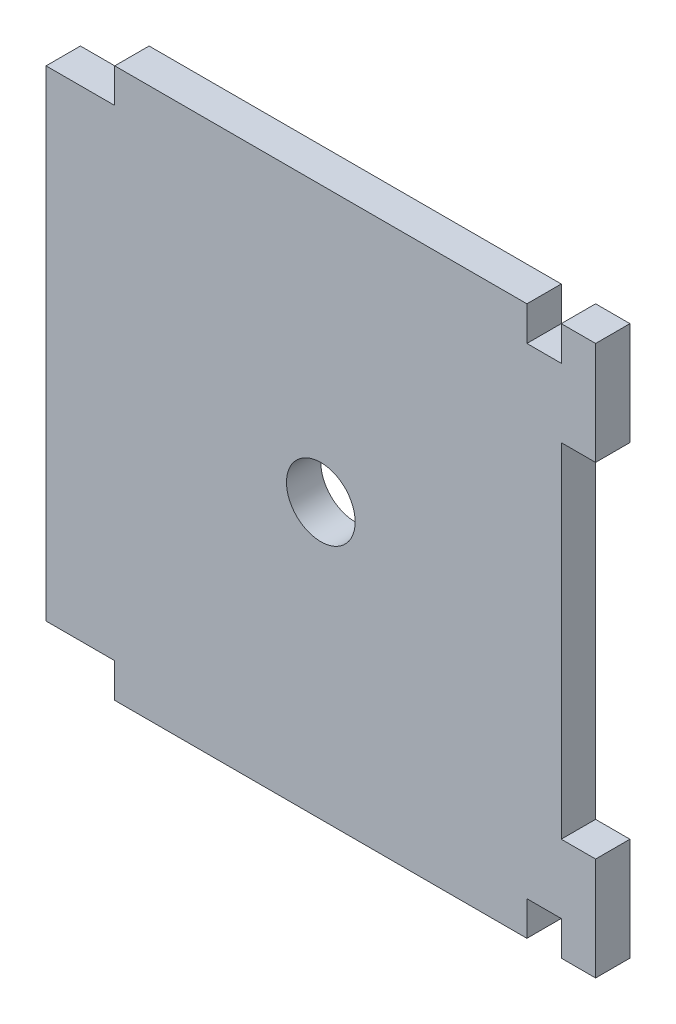
ISO-10303-21;
HEADER;
FILE_DESCRIPTION(('STEP AP214'),'2;1');
FILE_NAME('part.step','',(''),(''),'','','');
FILE_SCHEMA(('AUTOMOTIVE_DESIGN { 1 0 10303 214 1 1 1 1 }'));
ENDSEC;
DATA;
#1=APPLICATION_CONTEXT('core data for automotive mechanical design processes');
#2=APPLICATION_PROTOCOL_DEFINITION('international standard','automotive_design',2000,#1);
#3=PRODUCT_CONTEXT('',#1,'mechanical');
#4=PRODUCT('Part','Part','',(#3));
#5=PRODUCT_RELATED_PRODUCT_CATEGORY('part','',(#4));
#6=PRODUCT_DEFINITION_FORMATION('','',#4);
#7=PRODUCT_DEFINITION_CONTEXT('part definition',#1,'design');
#8=PRODUCT_DEFINITION('design','',#6,#7);
#9=PRODUCT_DEFINITION_SHAPE('','',#8);
#10=(LENGTH_UNIT() NAMED_UNIT(*) SI_UNIT(.MILLI.,.METRE.));
#11=(NAMED_UNIT(*) PLANE_ANGLE_UNIT() SI_UNIT($,.RADIAN.));
#12=(NAMED_UNIT(*) SI_UNIT($,.STERADIAN.) SOLID_ANGLE_UNIT());
#13=UNCERTAINTY_MEASURE_WITH_UNIT(LENGTH_MEASURE(1.E-05),#10,'distance_accuracy_value','');
#14=(GEOMETRIC_REPRESENTATION_CONTEXT(3) GLOBAL_UNCERTAINTY_ASSIGNED_CONTEXT((#13)) GLOBAL_UNIT_ASSIGNED_CONTEXT((#10,
#11,#12)) REPRESENTATION_CONTEXT('',''));
#15=CARTESIAN_POINT('',(0.,0.,0.));
#16=DIRECTION('',(0.,0.,1.));
#17=DIRECTION('',(1.,0.,0.));
#18=AXIS2_PLACEMENT_3D('',#15,#16,#17);
#19=CARTESIAN_POINT('',(80.,80.,5.));
#20=DIRECTION('',(0.,-1.,0.));
#21=DIRECTION('',(1.,0.,0.));
#22=AXIS2_PLACEMENT_3D('',#19,#20,#21);
#23=PLANE('',#22);
#24=DIRECTION('',(-1.,0.,0.));
#25=VECTOR('',#24,1.);
#26=CARTESIAN_POINT('',(80.,80.,0.));
#27=LINE('',#26,#25);
#28=CARTESIAN_POINT('',(80.,80.,0.));
#29=VERTEX_POINT('',#28);
#30=CARTESIAN_POINT('',(75.,80.,0.));
#31=VERTEX_POINT('',#30);
#32=EDGE_CURVE('E316',#29,#31,#27,.T.);
#33=ORIENTED_EDGE('',*,*,#32,.T.);
#34=DIRECTION('',(0.,0.,1.));
#35=VECTOR('',#34,1.);
#36=CARTESIAN_POINT('',(75.,80.,0.));
#37=LINE('',#36,#35);
#38=CARTESIAN_POINT('',(75.,80.,5.));
#39=VERTEX_POINT('',#38);
#40=EDGE_CURVE('E200',#31,#39,#37,.T.);
#41=ORIENTED_EDGE('',*,*,#40,.T.);
#42=DIRECTION('',(-1.,0.,0.));
#43=VECTOR('',#42,1.);
#44=CARTESIAN_POINT('',(80.,80.,5.));
#45=LINE('',#44,#43);
#46=CARTESIAN_POINT('',(80.,80.,5.));
#47=VERTEX_POINT('',#46);
#48=EDGE_CURVE('E304',#47,#39,#45,.T.);
#49=ORIENTED_EDGE('',*,*,#48,.F.);
#50=DIRECTION('',(0.,0.,-1.));
#51=VECTOR('',#50,1.);
#52=CARTESIAN_POINT('',(80.,80.,5.));
#53=LINE('',#52,#51);
#54=EDGE_CURVE('E11',#47,#29,#53,.T.);
#55=ORIENTED_EDGE('',*,*,#54,.T.);
#56=EDGE_LOOP('',(#33,#41,#49,#55));
#57=FACE_BOUND('',#56,.T.);
#58=ADVANCED_FACE('F33',(#57),#23,.F.);
#59=CARTESIAN_POINT('',(80.,0.,5.));
#60=DIRECTION('',(0.,1.,0.));
#61=DIRECTION('',(-1.,0.,0.));
#62=AXIS2_PLACEMENT_3D('',#59,#60,#61);
#63=PLANE('',#62);
#64=DIRECTION('',(1.,0.,0.));
#65=VECTOR('',#64,1.);
#66=CARTESIAN_POINT('',(80.,0.,5.));
#67=LINE('',#66,#65);
#68=CARTESIAN_POINT('',(75.,0.,5.));
#69=VERTEX_POINT('',#68);
#70=CARTESIAN_POINT('',(80.,0.,5.));
#71=VERTEX_POINT('',#70);
#72=EDGE_CURVE('E309',#69,#71,#67,.T.);
#73=ORIENTED_EDGE('',*,*,#72,.F.);
#74=DIRECTION('',(0.,0.,1.));
#75=VECTOR('',#74,1.);
#76=CARTESIAN_POINT('',(75.,0.,0.));
#77=LINE('',#76,#75);
#78=CARTESIAN_POINT('',(75.,0.,0.));
#79=VERTEX_POINT('',#78);
#80=EDGE_CURVE('E222',#79,#69,#77,.T.);
#81=ORIENTED_EDGE('',*,*,#80,.F.);
#82=DIRECTION('',(1.,0.,0.));
#83=VECTOR('',#82,1.);
#84=CARTESIAN_POINT('',(80.,0.,0.));
#85=LINE('',#84,#83);
#86=CARTESIAN_POINT('',(80.,0.,0.));
#87=VERTEX_POINT('',#86);
#88=EDGE_CURVE('E321',#79,#87,#85,.T.);
#89=ORIENTED_EDGE('',*,*,#88,.T.);
#90=DIRECTION('',(0.,0.,-1.));
#91=VECTOR('',#90,1.);
#92=CARTESIAN_POINT('',(80.,0.,5.));
#93=LINE('',#92,#91);
#94=EDGE_CURVE('E41',#71,#87,#93,.T.);
#95=ORIENTED_EDGE('',*,*,#94,.F.);
#96=EDGE_LOOP('',(#73,#81,#89,#95));
#97=FACE_BOUND('',#96,.T.);
#98=ADVANCED_FACE('F345',(#97),#63,.F.);
#99=CARTESIAN_POINT('',(80.,80.,5.));
#100=DIRECTION('',(-1.,0.,0.));
#101=DIRECTION('',(0.,-1.,0.));
#102=AXIS2_PLACEMENT_3D('',#99,#100,#101);
#103=PLANE('',#102);
#104=DIRECTION('',(0.,1.,0.));
#105=VECTOR('',#104,1.);
#106=CARTESIAN_POINT('',(80.,80.,0.));
#107=LINE('',#106,#105);
#108=CARTESIAN_POINT('',(80.,15.,0.));
#109=VERTEX_POINT('',#108);
#110=EDGE_CURVE('E313',#87,#109,#107,.T.);
#111=ORIENTED_EDGE('',*,*,#110,.T.);
#112=DIRECTION('',(0.,0.,1.));
#113=VECTOR('',#112,1.);
#114=CARTESIAN_POINT('',(80.,15.,0.));
#115=LINE('',#114,#113);
#116=CARTESIAN_POINT('',(80.,15.,5.));
#117=VERTEX_POINT('',#116);
#118=EDGE_CURVE('E247',#109,#117,#115,.T.);
#119=ORIENTED_EDGE('',*,*,#118,.T.);
#120=DIRECTION('',(0.,1.,0.));
#121=VECTOR('',#120,1.);
#122=CARTESIAN_POINT('',(80.,80.,5.));
#123=LINE('',#122,#121);
#124=EDGE_CURVE('E299',#71,#117,#123,.T.);
#125=ORIENTED_EDGE('',*,*,#124,.F.);
#126=ORIENTED_EDGE('',*,*,#94,.T.);
#127=EDGE_LOOP('',(#111,#119,#125,#126));
#128=FACE_BOUND('',#127,.T.);
#129=ADVANCED_FACE('F329',(#128),#103,.F.);
#130=CARTESIAN_POINT('',(0.,0.,5.));
#131=DIRECTION('',(0.,0.,-1.));
#132=DIRECTION('',(-1.,0.,0.));
#133=AXIS2_PLACEMENT_3D('',#130,#131,#132);
#134=PLANE('',#133);
#135=ORIENTED_EDGE('',*,*,#48,.T.);
#136=DIRECTION('',(0.,1.,0.));
#137=VECTOR('',#136,1.);
#138=CARTESIAN_POINT('',(75.,80.,5.));
#139=LINE('',#138,#137);
#140=CARTESIAN_POINT('',(75.,75.,5.));
#141=VERTEX_POINT('',#140);
#142=EDGE_CURVE('E192',#141,#39,#139,.T.);
#143=ORIENTED_EDGE('',*,*,#142,.F.);
#144=DIRECTION('',(1.,0.,0.));
#145=VECTOR('',#144,1.);
#146=CARTESIAN_POINT('',(75.,75.,5.));
#147=LINE('',#146,#145);
#148=CARTESIAN_POINT('',(70.,75.,5.));
#149=VERTEX_POINT('',#148);
#150=EDGE_CURVE('E194',#149,#141,#147,.T.);
#151=ORIENTED_EDGE('',*,*,#150,.F.);
#152=DIRECTION('',(0.,-1.,0.));
#153=VECTOR('',#152,1.);
#154=CARTESIAN_POINT('',(70.,80.,5.));
#155=LINE('',#154,#153);
#156=CARTESIAN_POINT('',(70.,80.,5.));
#157=VERTEX_POINT('',#156);
#158=EDGE_CURVE('E172',#157,#149,#155,.T.);
#159=ORIENTED_EDGE('',*,*,#158,.F.);
#160=CARTESIAN_POINT('',(10.,80.,5.));
#161=VERTEX_POINT('',#160);
#162=EDGE_CURVE('E302',#157,#161,#45,.T.);
#163=ORIENTED_EDGE('',*,*,#162,.T.);
#164=DIRECTION('',(0.,1.,0.));
#165=VECTOR('',#164,1.);
#166=CARTESIAN_POINT('',(10.,80.,5.));
#167=LINE('',#166,#165);
#168=CARTESIAN_POINT('',(10.,75.,5.));
#169=VERTEX_POINT('',#168);
#170=EDGE_CURVE('E260',#169,#161,#167,.T.);
#171=ORIENTED_EDGE('',*,*,#170,.F.);
#172=DIRECTION('',(1.,0.,0.));
#173=VECTOR('',#172,1.);
#174=CARTESIAN_POINT('',(0.,75.,5.));
#175=LINE('',#174,#173);
#176=CARTESIAN_POINT('',(0.,75.,5.));
#177=VERTEX_POINT('',#176);
#178=EDGE_CURVE('E250',#177,#169,#175,.T.);
#179=ORIENTED_EDGE('',*,*,#178,.F.);
#180=DIRECTION('',(0.,-1.,0.));
#181=VECTOR('',#180,1.);
#182=CARTESIAN_POINT('',(0.,80.,5.));
#183=LINE('',#182,#181);
#184=CARTESIAN_POINT('',(0.,5.,5.));
#185=VERTEX_POINT('',#184);
#186=EDGE_CURVE('E307',#177,#185,#183,.T.);
#187=ORIENTED_EDGE('',*,*,#186,.T.);
#188=DIRECTION('',(-1.,0.,0.));
#189=VECTOR('',#188,1.);
#190=CARTESIAN_POINT('',(0.,5.,5.));
#191=LINE('',#190,#189);
#192=CARTESIAN_POINT('',(10.,5.,5.));
#193=VERTEX_POINT('',#192);
#194=EDGE_CURVE('E278',#193,#185,#191,.T.);
#195=ORIENTED_EDGE('',*,*,#194,.F.);
#196=DIRECTION('',(0.,1.,0.));
#197=VECTOR('',#196,1.);
#198=CARTESIAN_POINT('',(10.,0.,5.));
#199=LINE('',#198,#197);
#200=CARTESIAN_POINT('',(10.,0.,5.));
#201=VERTEX_POINT('',#200);
#202=EDGE_CURVE('E270',#201,#193,#199,.T.);
#203=ORIENTED_EDGE('',*,*,#202,.F.);
#204=CARTESIAN_POINT('',(70.,0.,5.));
#205=VERTEX_POINT('',#204);
#206=EDGE_CURVE('E310',#201,#205,#67,.T.);
#207=ORIENTED_EDGE('',*,*,#206,.T.);
#208=DIRECTION('',(0.,-1.,0.));
#209=VECTOR('',#208,1.);
#210=CARTESIAN_POINT('',(70.,0.,5.));
#211=LINE('',#210,#209);
#212=CARTESIAN_POINT('',(70.,5.00000000000003,5.));
#213=VERTEX_POINT('',#212);
#214=EDGE_CURVE('E56',#213,#205,#211,.T.);
#215=ORIENTED_EDGE('',*,*,#214,.F.);
#216=DIRECTION('',(-1.,0.,0.));
#217=VECTOR('',#216,1.);
#218=CARTESIAN_POINT('',(75.,5.00000000000003,5.));
#219=LINE('',#218,#217);
#220=CARTESIAN_POINT('',(75.,5.00000000000003,5.));
#221=VERTEX_POINT('',#220);
#222=EDGE_CURVE('E218',#221,#213,#219,.T.);
#223=ORIENTED_EDGE('',*,*,#222,.F.);
#224=DIRECTION('',(0.,1.,0.));
#225=VECTOR('',#224,1.);
#226=CARTESIAN_POINT('',(75.,0.,5.));
#227=LINE('',#226,#225);
#228=EDGE_CURVE('E203',#69,#221,#227,.T.);
#229=ORIENTED_EDGE('',*,*,#228,.F.);
#230=ORIENTED_EDGE('',*,*,#72,.T.);
#231=ORIENTED_EDGE('',*,*,#124,.T.);
#232=DIRECTION('',(1.,0.,0.));
#233=VECTOR('',#232,1.);
#234=CARTESIAN_POINT('',(80.,15.,5.));
#235=LINE('',#234,#233);
#236=CARTESIAN_POINT('',(75.,15.,5.));
#237=VERTEX_POINT('',#236);
#238=EDGE_CURVE('E234',#237,#117,#235,.T.);
#239=ORIENTED_EDGE('',*,*,#238,.F.);
#240=DIRECTION('',(0.,-1.,0.));
#241=VECTOR('',#240,1.);
#242=CARTESIAN_POINT('',(75.,15.,5.));
#243=LINE('',#242,#241);
#244=CARTESIAN_POINT('',(75.,65.,5.));
#245=VERTEX_POINT('',#244);
#246=EDGE_CURVE('E243',#245,#237,#243,.T.);
#247=ORIENTED_EDGE('',*,*,#246,.F.);
#248=DIRECTION('',(-1.,0.,0.));
#249=VECTOR('',#248,1.);
#250=CARTESIAN_POINT('',(80.,65.,5.));
#251=LINE('',#250,#249);
#252=CARTESIAN_POINT('',(80.,65.,5.));
#253=VERTEX_POINT('',#252);
#254=EDGE_CURVE('E224',#253,#245,#251,.T.);
#255=ORIENTED_EDGE('',*,*,#254,.F.);
#256=EDGE_CURVE('E303',#253,#47,#123,.T.);
#257=ORIENTED_EDGE('',*,*,#256,.T.);
#258=EDGE_LOOP('',(#135,#143,#151,#159,#163,#171,#179,#187,#195,#203,#207,#215,#223,#229,#230,
#231,#239,#247,#255,#257));
#259=FACE_BOUND('',#258,.T.);
#260=CARTESIAN_POINT('',(40.,40.,5.));
#261=DIRECTION('',(0.,0.,1.));
#262=DIRECTION('',(1.,0.,0.));
#263=AXIS2_PLACEMENT_3D('',#260,#261,#262);
#264=CIRCLE('',#263,5.);
#265=CARTESIAN_POINT('',(45.,40.,5.));
#266=VERTEX_POINT('',#265);
#267=EDGE_CURVE('E293',#266,#266,#264,.T.);
#268=ORIENTED_EDGE('',*,*,#267,.F.);
#269=EDGE_LOOP('',(#268));
#270=FACE_BOUND('',#269,.T.);
#271=ADVANCED_FACE('F339',(#259,#270),#134,.F.);
#272=CARTESIAN_POINT('',(0.,0.,0.));
#273=DIRECTION('',(0.,0.,-1.));
#274=DIRECTION('',(-1.,0.,0.));
#275=AXIS2_PLACEMENT_3D('',#272,#273,#274);
#276=PLANE('',#275);
#277=DIRECTION('',(0.,1.,0.));
#278=VECTOR('',#277,1.);
#279=CARTESIAN_POINT('',(75.,80.,0.));
#280=LINE('',#279,#278);
#281=CARTESIAN_POINT('',(75.,75.,0.));
#282=VERTEX_POINT('',#281);
#283=EDGE_CURVE('E185',#282,#31,#280,.T.);
#284=ORIENTED_EDGE('',*,*,#283,.T.);
#285=ORIENTED_EDGE('',*,*,#32,.F.);
#286=CARTESIAN_POINT('',(80.,65.,0.));
#287=VERTEX_POINT('',#286);
#288=EDGE_CURVE('E296',#287,#29,#107,.T.);
#289=ORIENTED_EDGE('',*,*,#288,.F.);
#290=DIRECTION('',(-1.,0.,0.));
#291=VECTOR('',#290,1.);
#292=CARTESIAN_POINT('',(80.,65.,0.));
#293=LINE('',#292,#291);
#294=CARTESIAN_POINT('',(75.,65.,0.));
#295=VERTEX_POINT('',#294);
#296=EDGE_CURVE('E230',#287,#295,#293,.T.);
#297=ORIENTED_EDGE('',*,*,#296,.T.);
#298=DIRECTION('',(0.,-1.,0.));
#299=VECTOR('',#298,1.);
#300=CARTESIAN_POINT('',(75.,15.,0.));
#301=LINE('',#300,#299);
#302=CARTESIAN_POINT('',(75.,15.,0.));
#303=VERTEX_POINT('',#302);
#304=EDGE_CURVE('E233',#295,#303,#301,.T.);
#305=ORIENTED_EDGE('',*,*,#304,.T.);
#306=DIRECTION('',(1.,0.,0.));
#307=VECTOR('',#306,1.);
#308=CARTESIAN_POINT('',(80.,15.,0.));
#309=LINE('',#308,#307);
#310=EDGE_CURVE('E237',#303,#109,#309,.T.);
#311=ORIENTED_EDGE('',*,*,#310,.T.);
#312=ORIENTED_EDGE('',*,*,#110,.F.);
#313=ORIENTED_EDGE('',*,*,#88,.F.);
#314=DIRECTION('',(0.,1.,0.));
#315=VECTOR('',#314,1.);
#316=CARTESIAN_POINT('',(75.,0.,0.));
#317=LINE('',#316,#315);
#318=CARTESIAN_POINT('',(75.,5.00000000000003,0.));
#319=VERTEX_POINT('',#318);
#320=EDGE_CURVE('E206',#79,#319,#317,.T.);
#321=ORIENTED_EDGE('',*,*,#320,.T.);
#322=DIRECTION('',(-1.,0.,0.));
#323=VECTOR('',#322,1.);
#324=CARTESIAN_POINT('',(75.,5.00000000000003,0.));
#325=LINE('',#324,#323);
#326=CARTESIAN_POINT('',(70.,5.00000000000003,0.));
#327=VERTEX_POINT('',#326);
#328=EDGE_CURVE('E209',#319,#327,#325,.T.);
#329=ORIENTED_EDGE('',*,*,#328,.T.);
#330=DIRECTION('',(0.,-1.,0.));
#331=VECTOR('',#330,1.);
#332=CARTESIAN_POINT('',(70.,0.,0.));
#333=LINE('',#332,#331);
#334=CARTESIAN_POINT('',(70.,0.,0.));
#335=VERTEX_POINT('',#334);
#336=EDGE_CURVE('E212',#327,#335,#333,.T.);
#337=ORIENTED_EDGE('',*,*,#336,.T.);
#338=CARTESIAN_POINT('',(9.99999999999999,0.,0.));
#339=VERTEX_POINT('',#338);
#340=EDGE_CURVE('E322',#339,#335,#85,.T.);
#341=ORIENTED_EDGE('',*,*,#340,.F.);
#342=DIRECTION('',(0.,1.,0.));
#343=VECTOR('',#342,1.);
#344=CARTESIAN_POINT('',(10.,0.,0.));
#345=LINE('',#344,#343);
#346=CARTESIAN_POINT('',(10.,5.,0.));
#347=VERTEX_POINT('',#346);
#348=EDGE_CURVE('E274',#339,#347,#345,.T.);
#349=ORIENTED_EDGE('',*,*,#348,.T.);
#350=DIRECTION('',(-1.,0.,0.));
#351=VECTOR('',#350,1.);
#352=CARTESIAN_POINT('',(0.,5.,0.));
#353=LINE('',#352,#351);
#354=CARTESIAN_POINT('',(0.,5.,0.));
#355=VERTEX_POINT('',#354);
#356=EDGE_CURVE('E277',#347,#355,#353,.T.);
#357=ORIENTED_EDGE('',*,*,#356,.T.);
#358=DIRECTION('',(0.,-1.,0.));
#359=VECTOR('',#358,1.);
#360=CARTESIAN_POINT('',(0.,80.,0.));
#361=LINE('',#360,#359);
#362=CARTESIAN_POINT('',(0.,75.,0.));
#363=VERTEX_POINT('',#362);
#364=EDGE_CURVE('E319',#363,#355,#361,.T.);
#365=ORIENTED_EDGE('',*,*,#364,.F.);
#366=DIRECTION('',(1.,0.,0.));
#367=VECTOR('',#366,1.);
#368=CARTESIAN_POINT('',(0.,75.,0.));
#369=LINE('',#368,#367);
#370=CARTESIAN_POINT('',(10.,75.,0.));
#371=VERTEX_POINT('',#370);
#372=EDGE_CURVE('E256',#363,#371,#369,.T.);
#373=ORIENTED_EDGE('',*,*,#372,.T.);
#374=DIRECTION('',(0.,1.,0.));
#375=VECTOR('',#374,1.);
#376=CARTESIAN_POINT('',(10.,80.,0.));
#377=LINE('',#376,#375);
#378=CARTESIAN_POINT('',(10.,80.,0.));
#379=VERTEX_POINT('',#378);
#380=EDGE_CURVE('E259',#371,#379,#377,.T.);
#381=ORIENTED_EDGE('',*,*,#380,.T.);
#382=CARTESIAN_POINT('',(70.,80.,0.));
#383=VERTEX_POINT('',#382);
#384=EDGE_CURVE('E191',#383,#379,#27,.T.);
#385=ORIENTED_EDGE('',*,*,#384,.F.);
#386=DIRECTION('',(0.,-1.,0.));
#387=VECTOR('',#386,1.);
#388=CARTESIAN_POINT('',(70.,80.,0.));
#389=LINE('',#388,#387);
#390=CARTESIAN_POINT('',(70.,75.,0.));
#391=VERTEX_POINT('',#390);
#392=EDGE_CURVE('E48',#383,#391,#389,.T.);
#393=ORIENTED_EDGE('',*,*,#392,.T.);
#394=DIRECTION('',(1.,0.,0.));
#395=VECTOR('',#394,1.);
#396=CARTESIAN_POINT('',(75.,75.,0.));
#397=LINE('',#396,#395);
#398=EDGE_CURVE('E180',#391,#282,#397,.T.);
#399=ORIENTED_EDGE('',*,*,#398,.T.);
#400=EDGE_LOOP('',(#284,#285,#289,#297,#305,#311,#312,#313,#321,#329,#337,#341,#349,#357,#365,
#373,#381,#385,#393,#399));
#401=FACE_BOUND('',#400,.T.);
#402=CARTESIAN_POINT('',(40.,40.,0.));
#403=DIRECTION('',(0.,0.,1.));
#404=DIRECTION('',(1.,0.,0.));
#405=AXIS2_PLACEMENT_3D('',#402,#403,#404);
#406=CIRCLE('',#405,5.);
#407=CARTESIAN_POINT('',(45.,40.,0.));
#408=VERTEX_POINT('',#407);
#409=EDGE_CURVE('E289',#408,#408,#406,.T.);
#410=ORIENTED_EDGE('',*,*,#409,.T.);
#411=EDGE_LOOP('',(#410));
#412=FACE_BOUND('',#411,.T.);
#413=ADVANCED_FACE('F188',(#401,#412),#276,.T.);
#414=ORIENTED_EDGE('',*,*,#256,.F.);
#415=DIRECTION('',(0.,0.,1.));
#416=VECTOR('',#415,1.);
#417=CARTESIAN_POINT('',(80.,65.,0.));
#418=LINE('',#417,#416);
#419=EDGE_CURVE('E240',#287,#253,#418,.T.);
#420=ORIENTED_EDGE('',*,*,#419,.F.);
#421=ORIENTED_EDGE('',*,*,#288,.T.);
#422=ORIENTED_EDGE('',*,*,#54,.F.);
#423=EDGE_LOOP('',(#414,#420,#421,#422));
#424=FACE_BOUND('',#423,.T.);
#425=ADVANCED_FACE('F35',(#424),#103,.F.);
#426=ORIENTED_EDGE('',*,*,#162,.F.);
#427=DIRECTION('',(0.,0.,1.));
#428=VECTOR('',#427,1.);
#429=CARTESIAN_POINT('',(70.,80.,0.));
#430=LINE('',#429,#428);
#431=EDGE_CURVE('E177',#383,#157,#430,.T.);
#432=ORIENTED_EDGE('',*,*,#431,.F.);
#433=ORIENTED_EDGE('',*,*,#384,.T.);
#434=DIRECTION('',(0.,0.,1.));
#435=VECTOR('',#434,1.);
#436=CARTESIAN_POINT('',(10.,80.,0.));
#437=LINE('',#436,#435);
#438=EDGE_CURVE('E267',#379,#161,#437,.T.);
#439=ORIENTED_EDGE('',*,*,#438,.T.);
#440=EDGE_LOOP('',(#426,#432,#433,#439));
#441=FACE_BOUND('',#440,.T.);
#442=ADVANCED_FACE('F381',(#441),#23,.F.);
#443=CARTESIAN_POINT('',(0.,80.,5.));
#444=DIRECTION('',(1.,0.,0.));
#445=DIRECTION('',(0.,1.,0.));
#446=AXIS2_PLACEMENT_3D('',#443,#444,#445);
#447=PLANE('',#446);
#448=ORIENTED_EDGE('',*,*,#186,.F.);
#449=DIRECTION('',(0.,0.,1.));
#450=VECTOR('',#449,1.);
#451=CARTESIAN_POINT('',(0.,75.,0.));
#452=LINE('',#451,#450);
#453=EDGE_CURVE('E262',#363,#177,#452,.T.);
#454=ORIENTED_EDGE('',*,*,#453,.F.);
#455=ORIENTED_EDGE('',*,*,#364,.T.);
#456=DIRECTION('',(0.,0.,1.));
#457=VECTOR('',#456,1.);
#458=CARTESIAN_POINT('',(0.,5.,0.));
#459=LINE('',#458,#457);
#460=EDGE_CURVE('E286',#355,#185,#459,.T.);
#461=ORIENTED_EDGE('',*,*,#460,.T.);
#462=EDGE_LOOP('',(#448,#454,#455,#461));
#463=FACE_BOUND('',#462,.T.);
#464=ADVANCED_FACE('F369',(#463),#447,.F.);
#465=ORIENTED_EDGE('',*,*,#340,.T.);
#466=DIRECTION('',(0.,0.,1.));
#467=VECTOR('',#466,1.);
#468=CARTESIAN_POINT('',(70.,0.,0.));
#469=LINE('',#468,#467);
#470=EDGE_CURVE('E225',#335,#205,#469,.T.);
#471=ORIENTED_EDGE('',*,*,#470,.T.);
#472=ORIENTED_EDGE('',*,*,#206,.F.);
#473=DIRECTION('',(0.,0.,1.));
#474=VECTOR('',#473,1.);
#475=CARTESIAN_POINT('',(10.,0.,0.));
#476=LINE('',#475,#474);
#477=EDGE_CURVE('E281',#339,#201,#476,.T.);
#478=ORIENTED_EDGE('',*,*,#477,.F.);
#479=EDGE_LOOP('',(#465,#471,#472,#478));
#480=FACE_BOUND('',#479,.T.);
#481=ADVANCED_FACE('F356',(#480),#63,.F.);
#482=CARTESIAN_POINT('',(40.,40.,5.));
#483=DIRECTION('',(0.,0.,-1.));
#484=DIRECTION('',(-1.,0.,0.));
#485=AXIS2_PLACEMENT_3D('',#482,#483,#484);
#486=CYLINDRICAL_SURFACE('',#485,5.);
#487=ORIENTED_EDGE('',*,*,#267,.T.);
#488=EDGE_LOOP('',(#487));
#489=FACE_BOUND('',#488,.T.);
#490=ORIENTED_EDGE('',*,*,#409,.F.);
#491=EDGE_LOOP('',(#490));
#492=FACE_BOUND('',#491,.T.);
#493=ADVANCED_FACE('F429',(#489,#492),#486,.F.);
#494=CARTESIAN_POINT('',(0.,5.,0.));
#495=DIRECTION('',(0.,1.,0.));
#496=DIRECTION('',(0.,0.,1.));
#497=AXIS2_PLACEMENT_3D('',#494,#495,#496);
#498=PLANE('',#497);
#499=ORIENTED_EDGE('',*,*,#194,.T.);
#500=ORIENTED_EDGE('',*,*,#460,.F.);
#501=ORIENTED_EDGE('',*,*,#356,.F.);
#502=DIRECTION('',(0.,0.,1.));
#503=VECTOR('',#502,1.);
#504=CARTESIAN_POINT('',(10.,5.,0.));
#505=LINE('',#504,#503);
#506=EDGE_CURVE('E290',#347,#193,#505,.T.);
#507=ORIENTED_EDGE('',*,*,#506,.T.);
#508=EDGE_LOOP('',(#499,#500,#501,#507));
#509=FACE_BOUND('',#508,.T.);
#510=ADVANCED_FACE('F366',(#509),#498,.F.);
#511=CARTESIAN_POINT('',(10.,0.,0.));
#512=DIRECTION('',(1.,0.,0.));
#513=DIRECTION('',(0.,0.,-1.));
#514=AXIS2_PLACEMENT_3D('',#511,#512,#513);
#515=PLANE('',#514);
#516=ORIENTED_EDGE('',*,*,#202,.T.);
#517=ORIENTED_EDGE('',*,*,#506,.F.);
#518=ORIENTED_EDGE('',*,*,#348,.F.);
#519=ORIENTED_EDGE('',*,*,#477,.T.);
#520=EDGE_LOOP('',(#516,#517,#518,#519));
#521=FACE_BOUND('',#520,.T.);
#522=ADVANCED_FACE('F361',(#521),#515,.F.);
#523=CARTESIAN_POINT('',(10.,80.,0.));
#524=DIRECTION('',(1.,0.,0.));
#525=DIRECTION('',(0.,0.,-1.));
#526=AXIS2_PLACEMENT_3D('',#523,#524,#525);
#527=PLANE('',#526);
#528=ORIENTED_EDGE('',*,*,#170,.T.);
#529=ORIENTED_EDGE('',*,*,#438,.F.);
#530=ORIENTED_EDGE('',*,*,#380,.F.);
#531=DIRECTION('',(0.,0.,1.));
#532=VECTOR('',#531,1.);
#533=CARTESIAN_POINT('',(10.,75.,0.));
#534=LINE('',#533,#532);
#535=EDGE_CURVE('E271',#371,#169,#534,.T.);
#536=ORIENTED_EDGE('',*,*,#535,.T.);
#537=EDGE_LOOP('',(#528,#529,#530,#536));
#538=FACE_BOUND('',#537,.T.);
#539=ADVANCED_FACE('F378',(#538),#527,.F.);
#540=CARTESIAN_POINT('',(0.,75.,0.));
#541=DIRECTION('',(0.,-1.,0.));
#542=DIRECTION('',(0.,0.,-1.));
#543=AXIS2_PLACEMENT_3D('',#540,#541,#542);
#544=PLANE('',#543);
#545=ORIENTED_EDGE('',*,*,#178,.T.);
#546=ORIENTED_EDGE('',*,*,#535,.F.);
#547=ORIENTED_EDGE('',*,*,#372,.F.);
#548=ORIENTED_EDGE('',*,*,#453,.T.);
#549=EDGE_LOOP('',(#545,#546,#547,#548));
#550=FACE_BOUND('',#549,.T.);
#551=ADVANCED_FACE('F373',(#550),#544,.F.);
#552=CARTESIAN_POINT('',(80.,15.,0.));
#553=DIRECTION('',(0.,-1.,0.));
#554=DIRECTION('',(0.,0.,-1.));
#555=AXIS2_PLACEMENT_3D('',#552,#553,#554);
#556=PLANE('',#555);
#557=ORIENTED_EDGE('',*,*,#238,.T.);
#558=ORIENTED_EDGE('',*,*,#118,.F.);
#559=ORIENTED_EDGE('',*,*,#310,.F.);
#560=DIRECTION('',(0.,0.,1.));
#561=VECTOR('',#560,1.);
#562=CARTESIAN_POINT('',(75.,15.,0.));
#563=LINE('',#562,#561);
#564=EDGE_CURVE('E251',#303,#237,#563,.T.);
#565=ORIENTED_EDGE('',*,*,#564,.T.);
#566=EDGE_LOOP('',(#557,#558,#559,#565));
#567=FACE_BOUND('',#566,.T.);
#568=ADVANCED_FACE('F336',(#567),#556,.F.);
#569=CARTESIAN_POINT('',(75.,15.,0.));
#570=DIRECTION('',(-1.,0.,0.));
#571=DIRECTION('',(0.,0.,1.));
#572=AXIS2_PLACEMENT_3D('',#569,#570,#571);
#573=PLANE('',#572);
#574=ORIENTED_EDGE('',*,*,#246,.T.);
#575=ORIENTED_EDGE('',*,*,#564,.F.);
#576=ORIENTED_EDGE('',*,*,#304,.F.);
#577=DIRECTION('',(0.,0.,1.));
#578=VECTOR('',#577,1.);
#579=CARTESIAN_POINT('',(75.,65.,0.));
#580=LINE('',#579,#578);
#581=EDGE_CURVE('E253',#295,#245,#580,.T.);
#582=ORIENTED_EDGE('',*,*,#581,.T.);
#583=EDGE_LOOP('',(#574,#575,#576,#582));
#584=FACE_BOUND('',#583,.T.);
#585=ADVANCED_FACE('F397',(#584),#573,.F.);
#586=CARTESIAN_POINT('',(80.,65.,0.));
#587=DIRECTION('',(0.,1.,0.));
#588=DIRECTION('',(0.,0.,1.));
#589=AXIS2_PLACEMENT_3D('',#586,#587,#588);
#590=PLANE('',#589);
#591=ORIENTED_EDGE('',*,*,#254,.T.);
#592=ORIENTED_EDGE('',*,*,#581,.F.);
#593=ORIENTED_EDGE('',*,*,#296,.F.);
#594=ORIENTED_EDGE('',*,*,#419,.T.);
#595=EDGE_LOOP('',(#591,#592,#593,#594));
#596=FACE_BOUND('',#595,.T.);
#597=ADVANCED_FACE('F395',(#596),#590,.F.);
#598=CARTESIAN_POINT('',(75.,0.,0.));
#599=DIRECTION('',(1.,0.,0.));
#600=DIRECTION('',(0.,0.,-1.));
#601=AXIS2_PLACEMENT_3D('',#598,#599,#600);
#602=PLANE('',#601);
#603=ORIENTED_EDGE('',*,*,#228,.T.);
#604=DIRECTION('',(0.,0.,1.));
#605=VECTOR('',#604,1.);
#606=CARTESIAN_POINT('',(75.,5.00000000000003,0.));
#607=LINE('',#606,#605);
#608=EDGE_CURVE('E215',#319,#221,#607,.T.);
#609=ORIENTED_EDGE('',*,*,#608,.F.);
#610=ORIENTED_EDGE('',*,*,#320,.F.);
#611=ORIENTED_EDGE('',*,*,#80,.T.);
#612=EDGE_LOOP('',(#603,#609,#610,#611));
#613=FACE_BOUND('',#612,.T.);
#614=ADVANCED_FACE('F347',(#613),#602,.F.);
#615=CARTESIAN_POINT('',(70.,0.,0.));
#616=DIRECTION('',(-1.,0.,0.));
#617=DIRECTION('',(0.,0.,1.));
#618=AXIS2_PLACEMENT_3D('',#615,#616,#617);
#619=PLANE('',#618);
#620=ORIENTED_EDGE('',*,*,#214,.T.);
#621=ORIENTED_EDGE('',*,*,#470,.F.);
#622=ORIENTED_EDGE('',*,*,#336,.F.);
#623=DIRECTION('',(0.,0.,1.));
#624=VECTOR('',#623,1.);
#625=CARTESIAN_POINT('',(70.,5.00000000000003,0.));
#626=LINE('',#625,#624);
#627=EDGE_CURVE('E227',#327,#213,#626,.T.);
#628=ORIENTED_EDGE('',*,*,#627,.T.);
#629=EDGE_LOOP('',(#620,#621,#622,#628));
#630=FACE_BOUND('',#629,.T.);
#631=ADVANCED_FACE('F353',(#630),#619,.F.);
#632=CARTESIAN_POINT('',(75.,5.00000000000003,0.));
#633=DIRECTION('',(0.,1.,0.));
#634=DIRECTION('',(-1.,0.,0.));
#635=AXIS2_PLACEMENT_3D('',#632,#633,#634);
#636=PLANE('',#635);
#637=ORIENTED_EDGE('',*,*,#222,.T.);
#638=ORIENTED_EDGE('',*,*,#627,.F.);
#639=ORIENTED_EDGE('',*,*,#328,.F.);
#640=ORIENTED_EDGE('',*,*,#608,.T.);
#641=EDGE_LOOP('',(#637,#638,#639,#640));
#642=FACE_BOUND('',#641,.T.);
#643=ADVANCED_FACE('F352',(#642),#636,.F.);
#644=CARTESIAN_POINT('',(75.,80.,0.));
#645=DIRECTION('',(1.,0.,0.));
#646=DIRECTION('',(0.,0.,-1.));
#647=AXIS2_PLACEMENT_3D('',#644,#645,#646);
#648=PLANE('',#647);
#649=ORIENTED_EDGE('',*,*,#142,.T.);
#650=ORIENTED_EDGE('',*,*,#40,.F.);
#651=ORIENTED_EDGE('',*,*,#283,.F.);
#652=DIRECTION('',(0.,0.,1.));
#653=VECTOR('',#652,1.);
#654=CARTESIAN_POINT('',(75.,75.,0.));
#655=LINE('',#654,#653);
#656=EDGE_CURVE('E176',#282,#141,#655,.T.);
#657=ORIENTED_EDGE('',*,*,#656,.T.);
#658=EDGE_LOOP('',(#649,#650,#651,#657));
#659=FACE_BOUND('',#658,.T.);
#660=ADVANCED_FACE('F385',(#659),#648,.F.);
#661=CARTESIAN_POINT('',(75.,75.,0.));
#662=DIRECTION('',(0.,-1.,0.));
#663=DIRECTION('',(0.,0.,-1.));
#664=AXIS2_PLACEMENT_3D('',#661,#662,#663);
#665=PLANE('',#664);
#666=ORIENTED_EDGE('',*,*,#150,.T.);
#667=ORIENTED_EDGE('',*,*,#656,.F.);
#668=ORIENTED_EDGE('',*,*,#398,.F.);
#669=DIRECTION('',(0.,0.,1.));
#670=VECTOR('',#669,1.);
#671=CARTESIAN_POINT('',(70.,75.,0.));
#672=LINE('',#671,#670);
#673=EDGE_CURVE('E168',#391,#149,#672,.T.);
#674=ORIENTED_EDGE('',*,*,#673,.T.);
#675=EDGE_LOOP('',(#666,#667,#668,#674));
#676=FACE_BOUND('',#675,.T.);
#677=ADVANCED_FACE('F181',(#676),#665,.F.);
#678=CARTESIAN_POINT('',(70.,80.,0.));
#679=DIRECTION('',(-1.,0.,0.));
#680=DIRECTION('',(0.,0.,1.));
#681=AXIS2_PLACEMENT_3D('',#678,#679,#680);
#682=PLANE('',#681);
#683=ORIENTED_EDGE('',*,*,#158,.T.);
#684=ORIENTED_EDGE('',*,*,#673,.F.);
#685=ORIENTED_EDGE('',*,*,#392,.F.);
#686=ORIENTED_EDGE('',*,*,#431,.T.);
#687=EDGE_LOOP('',(#683,#684,#685,#686));
#688=FACE_BOUND('',#687,.T.);
#689=ADVANCED_FACE('F170',(#688),#682,.F.);
#690=CLOSED_SHELL('',(#58,#98,#129,#271,#413,#425,#442,#464,#481,#493,#510,#522,#539,#551,#568,
#585,#597,#614,#631,#643,#660,#677,#689));
#691=MANIFOLD_SOLID_BREP('B2',#690);
#692=ADVANCED_BREP_SHAPE_REPRESENTATION('',(#18,#691),#14);
#693=SHAPE_DEFINITION_REPRESENTATION(#9,#692);
ENDSEC;
END-ISO-10303-21;
